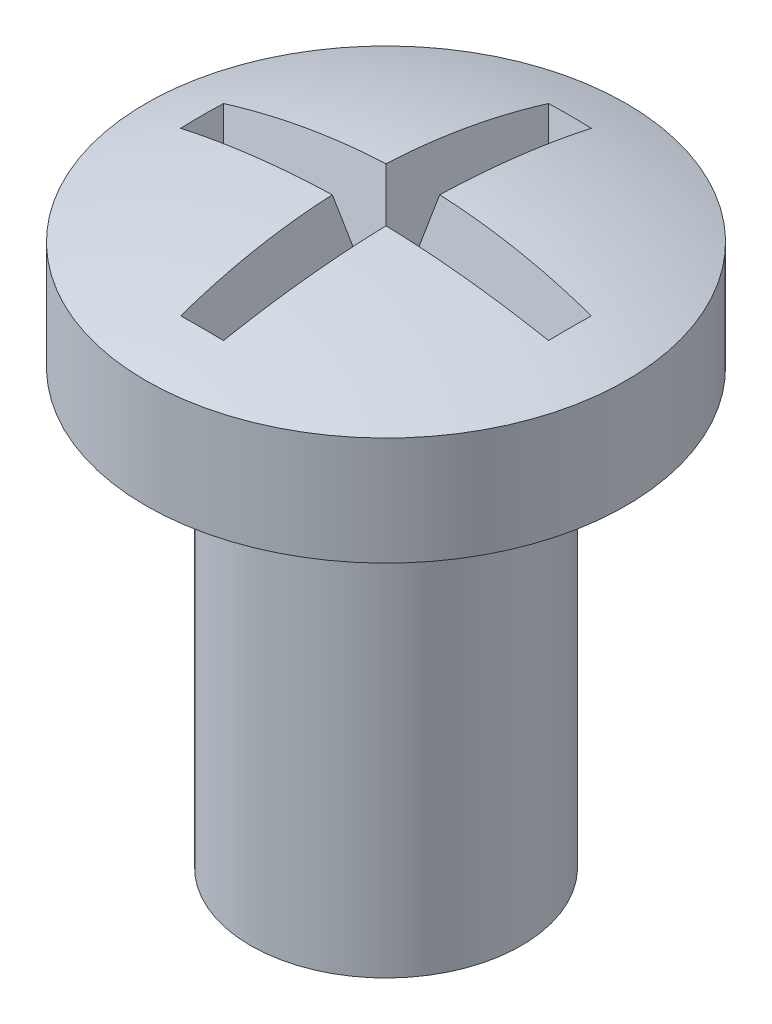
ISO-10303-21;
HEADER;
FILE_DESCRIPTION(('STEP AP214'),'2;1');
FILE_NAME('part.step','',(''),(''),'','','');
FILE_SCHEMA(('AUTOMOTIVE_DESIGN { 1 0 10303 214 1 1 1 1 }'));
ENDSEC;
DATA;
#1=APPLICATION_CONTEXT('core data for automotive mechanical design processes');
#2=APPLICATION_PROTOCOL_DEFINITION('international standard','automotive_design',2000,#1);
#3=PRODUCT_CONTEXT('',#1,'mechanical');
#4=PRODUCT('Part','Part','',(#3));
#5=PRODUCT_RELATED_PRODUCT_CATEGORY('part','',(#4));
#6=PRODUCT_DEFINITION_FORMATION('','',#4);
#7=PRODUCT_DEFINITION_CONTEXT('part definition',#1,'design');
#8=PRODUCT_DEFINITION('design','',#6,#7);
#9=PRODUCT_DEFINITION_SHAPE('','',#8);
#10=(LENGTH_UNIT() NAMED_UNIT(*) SI_UNIT(.MILLI.,.METRE.));
#11=(NAMED_UNIT(*) PLANE_ANGLE_UNIT() SI_UNIT($,.RADIAN.));
#12=(NAMED_UNIT(*) SI_UNIT($,.STERADIAN.) SOLID_ANGLE_UNIT());
#13=UNCERTAINTY_MEASURE_WITH_UNIT(LENGTH_MEASURE(1.E-05),#10,'distance_accuracy_value','');
#14=(GEOMETRIC_REPRESENTATION_CONTEXT(3) GLOBAL_UNCERTAINTY_ASSIGNED_CONTEXT((#13)) GLOBAL_UNIT_ASSIGNED_CONTEXT((#10,
#11,#12)) REPRESENTATION_CONTEXT('',''));
#15=CARTESIAN_POINT('',(0.,0.,0.));
#16=DIRECTION('',(0.,0.,1.));
#17=DIRECTION('',(1.,0.,0.));
#18=AXIS2_PLACEMENT_3D('',#15,#16,#17);
#19=CARTESIAN_POINT('',(0.,0.,0.));
#20=DIRECTION('',(0.,-1.,0.));
#21=DIRECTION('',(0.,0.,-1.));
#22=AXIS2_PLACEMENT_3D('',#19,#20,#21);
#23=PLANE('',#22);
#24=CARTESIAN_POINT('',(0.,0.,0.));
#25=DIRECTION('',(0.,1.,0.));
#26=DIRECTION('',(0.,0.,1.));
#27=AXIS2_PLACEMENT_3D('',#24,#25,#26);
#28=CIRCLE('',#27,1.25);
#29=CARTESIAN_POINT('',(0.,0.,1.25));
#30=VERTEX_POINT('',#29);
#31=EDGE_CURVE('E202',#30,#30,#28,.T.);
#32=ORIENTED_EDGE('',*,*,#31,.F.);
#33=EDGE_LOOP('',(#32));
#34=FACE_BOUND('',#33,.T.);
#35=ADVANCED_FACE('F39',(#34),#23,.T.);
#36=CARTESIAN_POINT('',(0.,5.38661268781676,0.));
#37=DIRECTION('',(0.,1.,0.));
#38=DIRECTION('',(0.,0.,1.));
#39=AXIS2_PLACEMENT_3D('',#36,#37,#38);
#40=CYLINDRICAL_SURFACE('',#39,1.25);
#41=ORIENTED_EDGE('',*,*,#31,.T.);
#42=EDGE_LOOP('',(#41));
#43=FACE_BOUND('',#42,.T.);
#44=CARTESIAN_POINT('',(0.,4.,0.));
#45=DIRECTION('',(0.,1.,0.));
#46=DIRECTION('',(0.,0.,1.));
#47=AXIS2_PLACEMENT_3D('',#44,#45,#46);
#48=CIRCLE('',#47,1.25);
#49=CARTESIAN_POINT('',(0.,4.,1.25));
#50=VERTEX_POINT('',#49);
#51=EDGE_CURVE('E198',#50,#50,#48,.T.);
#52=ORIENTED_EDGE('',*,*,#51,.F.);
#53=EDGE_LOOP('',(#52));
#54=FACE_BOUND('',#53,.T.);
#55=ADVANCED_FACE('F301',(#43,#54),#40,.T.);
#56=CARTESIAN_POINT('',(-1.25,4.,0.));
#57=DIRECTION('',(0.,-1.,0.));
#58=DIRECTION('',(0.,0.,-1.));
#59=AXIS2_PLACEMENT_3D('',#56,#57,#58);
#60=PLANE('',#59);
#61=ORIENTED_EDGE('',*,*,#51,.T.);
#62=EDGE_LOOP('',(#61));
#63=FACE_BOUND('',#62,.T.);
#64=CARTESIAN_POINT('',(0.,4.,0.));
#65=DIRECTION('',(0.,1.,0.));
#66=DIRECTION('',(0.,0.,1.));
#67=AXIS2_PLACEMENT_3D('',#64,#65,#66);
#68=CIRCLE('',#67,2.21653572712445);
#69=CARTESIAN_POINT('',(0.,4.,2.21653572712445));
#70=VERTEX_POINT('',#69);
#71=EDGE_CURVE('E194',#70,#70,#68,.T.);
#72=ORIENTED_EDGE('',*,*,#71,.F.);
#73=EDGE_LOOP('',(#72));
#74=FACE_BOUND('',#73,.T.);
#75=ADVANCED_FACE('F306',(#63,#74),#60,.T.);
#76=CARTESIAN_POINT('',(0.,5.38661268781676,0.));
#77=DIRECTION('',(0.,1.,0.));
#78=DIRECTION('',(0.,0.,1.));
#79=AXIS2_PLACEMENT_3D('',#76,#77,#78);
#80=CYLINDRICAL_SURFACE('',#79,2.21653572712445);
#81=ORIENTED_EDGE('',*,*,#71,.T.);
#82=EDGE_LOOP('',(#81));
#83=FACE_BOUND('',#82,.T.);
#84=CARTESIAN_POINT('',(0.,5.,0.));
#85=DIRECTION('',(0.,1.,0.));
#86=DIRECTION('',(0.,0.,1.));
#87=AXIS2_PLACEMENT_3D('',#84,#85,#86);
#88=CIRCLE('',#87,2.21653572712445);
#89=CARTESIAN_POINT('',(0.,5.,2.21653572712445));
#90=VERTEX_POINT('',#89);
#91=EDGE_CURVE('E133',#90,#90,#88,.T.);
#92=ORIENTED_EDGE('',*,*,#91,.F.);
#93=EDGE_LOOP('',(#92));
#94=FACE_BOUND('',#93,.T.);
#95=ADVANCED_FACE('F314',(#83,#94),#80,.T.);
#96=CARTESIAN_POINT('',(0.,-1.16063751831128,0.));
#97=DIRECTION('',(0.,1.,0.));
#98=DIRECTION('',(-1.,0.,0.));
#99=AXIS2_PLACEMENT_3D('',#96,#97,#98);
#100=SPHERICAL_SURFACE('',#99,6.54725020612804);
#101=CARTESIAN_POINT('',(-1.19771353480029,-0.884123561045328,0.));
#102=DIRECTION('',(0.974370064785235,-0.224951054343865,0.));
#103=DIRECTION('',(0.224951054343865,0.974370064785235,0.));
#104=AXIS2_PLACEMENT_3D('',#101,#102,#103);
#105=CIRCLE('',#104,6.43082479792732);
#106=CARTESIAN_POINT('',(0.247832627307662,5.37722476528932,-0.247832627307663));
#107=VERTEX_POINT('',#106);
#108=CARTESIAN_POINT('',(0.19759390976373,5.1596169722928,-1.69759390976373));
#109=VERTEX_POINT('',#108);
#110=EDGE_CURVE('E11',#107,#109,#105,.F.);
#111=ORIENTED_EDGE('',*,*,#110,.F.);
#112=CARTESIAN_POINT('',(0.,-0.884123561045328,1.19771353480029));
#113=DIRECTION('',(0.,-0.224951054343865,-0.974370064785235));
#114=DIRECTION('',(0.,0.974370064785235,-0.224951054343865));
#115=AXIS2_PLACEMENT_3D('',#112,#113,#114);
#116=CIRCLE('',#115,6.43082479792732);
#117=CARTESIAN_POINT('',(1.69759390976373,5.1596169722928,-0.197593909763731));
#118=VERTEX_POINT('',#117);
#119=EDGE_CURVE('E47',#118,#107,#116,.F.);
#120=ORIENTED_EDGE('',*,*,#119,.F.);
#121=CARTESIAN_POINT('',(0.226381999924083,-1.21290192113714,0.));
#122=DIRECTION('',(0.974370064785235,-0.224951054343865,0.));
#123=DIRECTION('',(0.224951054343865,0.974370064785235,0.));
#124=AXIS2_PLACEMENT_3D('',#121,#122,#123);
#125=CIRCLE('',#124,6.54312653736356);
#126=CARTESIAN_POINT('',(1.69759390976373,5.1596169722928,0.19759390976373));
#127=VERTEX_POINT('',#126);
#128=EDGE_CURVE('E233',#127,#118,#125,.F.);
#129=ORIENTED_EDGE('',*,*,#128,.F.);
#130=CARTESIAN_POINT('',(0.,-0.884123561045328,-1.19771353480029));
#131=DIRECTION('',(0.,-0.224951054343865,0.974370064785235));
#132=DIRECTION('',(0.,-0.974370064785235,-0.224951054343865));
#133=AXIS2_PLACEMENT_3D('',#130,#131,#132);
#134=CIRCLE('',#133,6.43082479792732);
#135=CARTESIAN_POINT('',(0.247832627307663,5.37722476528932,0.247832627307661));
#136=VERTEX_POINT('',#135);
#137=EDGE_CURVE('E230',#136,#127,#134,.F.);
#138=ORIENTED_EDGE('',*,*,#137,.F.);
#139=CARTESIAN_POINT('',(-1.19771353480029,-0.884123561045328,0.));
#140=DIRECTION('',(0.974370064785235,-0.224951054343865,0.));
#141=DIRECTION('',(0.224951054343865,0.974370064785235,0.));
#142=AXIS2_PLACEMENT_3D('',#139,#140,#141);
#143=CIRCLE('',#142,6.43082479792732);
#144=CARTESIAN_POINT('',(0.19759390976373,5.1596169722928,1.69759390976373));
#145=VERTEX_POINT('',#144);
#146=EDGE_CURVE('E227',#145,#136,#143,.F.);
#147=ORIENTED_EDGE('',*,*,#146,.F.);
#148=CARTESIAN_POINT('',(0.,-1.21290192113714,0.226381999924083));
#149=DIRECTION('',(0.,-0.224951054343865,0.974370064785235));
#150=DIRECTION('',(0.,-0.974370064785235,-0.224951054343865));
#151=AXIS2_PLACEMENT_3D('',#148,#149,#150);
#152=CIRCLE('',#151,6.54312653736356);
#153=CARTESIAN_POINT('',(-0.197593909763731,5.1596169722928,1.69759390976373));
#154=VERTEX_POINT('',#153);
#155=EDGE_CURVE('E224',#154,#145,#152,.F.);
#156=ORIENTED_EDGE('',*,*,#155,.F.);
#157=CARTESIAN_POINT('',(1.19771353480029,-0.884123561045328,0.));
#158=DIRECTION('',(-0.974370064785235,-0.224951054343865,0.));
#159=DIRECTION('',(0.224951054343865,-0.974370064785235,0.));
#160=AXIS2_PLACEMENT_3D('',#157,#158,#159);
#161=CIRCLE('',#160,6.43082479792732);
#162=CARTESIAN_POINT('',(-0.247832627307663,5.37722476528932,0.247832627307662));
#163=VERTEX_POINT('',#162);
#164=EDGE_CURVE('E221',#163,#154,#161,.F.);
#165=ORIENTED_EDGE('',*,*,#164,.F.);
#166=CARTESIAN_POINT('',(0.,-0.884123561045328,-1.19771353480029));
#167=DIRECTION('',(0.,-0.224951054343865,0.974370064785235));
#168=DIRECTION('',(0.,-0.974370064785235,-0.224951054343865));
#169=AXIS2_PLACEMENT_3D('',#166,#167,#168);
#170=CIRCLE('',#169,6.43082479792732);
#171=CARTESIAN_POINT('',(-1.69759390976373,5.1596169722928,0.19759390976373));
#172=VERTEX_POINT('',#171);
#173=EDGE_CURVE('E218',#172,#163,#170,.F.);
#174=ORIENTED_EDGE('',*,*,#173,.F.);
#175=CARTESIAN_POINT('',(-0.226381999924084,-1.21290192113714,0.));
#176=DIRECTION('',(-0.974370064785235,-0.224951054343865,0.));
#177=DIRECTION('',(0.224951054343865,-0.974370064785235,0.));
#178=AXIS2_PLACEMENT_3D('',#175,#176,#177);
#179=CIRCLE('',#178,6.54312653736356);
#180=CARTESIAN_POINT('',(-1.69759390976373,5.1596169722928,-0.197593909763731));
#181=VERTEX_POINT('',#180);
#182=EDGE_CURVE('E215',#181,#172,#179,.F.);
#183=ORIENTED_EDGE('',*,*,#182,.F.);
#184=CARTESIAN_POINT('',(0.,-0.884123561045328,1.19771353480029));
#185=DIRECTION('',(0.,-0.224951054343865,-0.974370064785235));
#186=DIRECTION('',(0.,0.974370064785235,-0.224951054343865));
#187=AXIS2_PLACEMENT_3D('',#184,#185,#186);
#188=CIRCLE('',#187,6.43082479792732);
#189=CARTESIAN_POINT('',(-0.247832627307663,5.37722476528932,-0.247832627307664));
#190=VERTEX_POINT('',#189);
#191=EDGE_CURVE('E212',#190,#181,#188,.F.);
#192=ORIENTED_EDGE('',*,*,#191,.F.);
#193=CARTESIAN_POINT('',(1.19771353480029,-0.884123561045328,0.));
#194=DIRECTION('',(-0.974370064785235,-0.224951054343865,0.));
#195=DIRECTION('',(0.224951054343865,-0.974370064785235,0.));
#196=AXIS2_PLACEMENT_3D('',#193,#194,#195);
#197=CIRCLE('',#196,6.43082479792732);
#198=CARTESIAN_POINT('',(-0.19759390976373,5.1596169722928,-1.69759390976373));
#199=VERTEX_POINT('',#198);
#200=EDGE_CURVE('E209',#199,#190,#197,.F.);
#201=ORIENTED_EDGE('',*,*,#200,.F.);
#202=CARTESIAN_POINT('',(0.,-1.21290192113714,-0.226381999924084));
#203=DIRECTION('',(0.,-0.224951054343865,-0.974370064785235));
#204=DIRECTION('',(0.,0.974370064785235,-0.224951054343865));
#205=AXIS2_PLACEMENT_3D('',#202,#203,#204);
#206=CIRCLE('',#205,6.54312653736356);
#207=EDGE_CURVE('E206',#109,#199,#206,.F.);
#208=ORIENTED_EDGE('',*,*,#207,.F.);
#209=EDGE_LOOP('',(#111,#120,#129,#138,#147,#156,#165,#174,#183,#192,#201,#208));
#210=FACE_BOUND('',#209,.T.);
#211=ORIENTED_EDGE('',*,*,#91,.T.);
#212=EDGE_LOOP('',(#211));
#213=FACE_BOUND('',#212,.T.);
#214=ADVANCED_FACE('F279',(#210,#213),#100,.T.);
#215=CARTESIAN_POINT('',(0.25,5.38661268781676,-0.250000000000001));
#216=DIRECTION('',(0.974370064785235,-0.224951054343865,0.));
#217=DIRECTION('',(0.224951054343865,0.974370064785235,0.));
#218=AXIS2_PLACEMENT_3D('',#215,#216,#217);
#219=PLANE('',#218);
#220=ORIENTED_EDGE('',*,*,#110,.T.);
#221=DIRECTION('',(0.219466743499904,0.950614904677543,-0.219466743499904));
#222=VECTOR('',#221,1.);
#223=CARTESIAN_POINT('',(0.177751522746321,5.07367015163868,-1.67775152274632));
#224=LINE('',#223,#222);
#225=CARTESIAN_POINT('',(0.0422186279869929,4.48661268781676,-1.54221862798699));
#226=VERTEX_POINT('',#225);
#227=EDGE_CURVE('E54',#226,#109,#224,.T.);
#228=ORIENTED_EDGE('',*,*,#227,.F.);
#229=DIRECTION('',(0.,0.,-1.));
#230=VECTOR('',#229,1.);
#231=CARTESIAN_POINT('',(0.0422186279869929,4.48661268781676,-0.250000000000001));
#232=LINE('',#231,#230);
#233=CARTESIAN_POINT('',(0.0422186279869929,4.48661268781676,-0.0422186279869938));
#234=VERTEX_POINT('',#233);
#235=EDGE_CURVE('E137',#234,#226,#232,.T.);
#236=ORIENTED_EDGE('',*,*,#235,.F.);
#237=DIRECTION('',(0.219466743499904,0.950614904677543,-0.219466743499904));
#238=VECTOR('',#237,1.);
#239=CARTESIAN_POINT('',(0.25,5.38661268781676,-0.250000000000001));
#240=LINE('',#239,#238);
#241=EDGE_CURVE('E125',#234,#107,#240,.T.);
#242=ORIENTED_EDGE('',*,*,#241,.T.);
#243=EDGE_LOOP('',(#220,#228,#236,#242));
#244=FACE_BOUND('',#243,.T.);
#245=ADVANCED_FACE('F138',(#244),#219,.F.);
#246=CARTESIAN_POINT('',(1.75,5.38661268781676,-0.250000000000001));
#247=DIRECTION('',(0.,-0.224951054343865,-0.974370064785235));
#248=DIRECTION('',(0.,0.974370064785235,-0.224951054343865));
#249=AXIS2_PLACEMENT_3D('',#246,#247,#248);
#250=PLANE('',#249);
#251=ORIENTED_EDGE('',*,*,#119,.T.);
#252=ORIENTED_EDGE('',*,*,#241,.F.);
#253=DIRECTION('',(-1.,0.,0.));
#254=VECTOR('',#253,1.);
#255=CARTESIAN_POINT('',(1.75,4.48661268781676,-0.0422186279869937));
#256=LINE('',#255,#254);
#257=CARTESIAN_POINT('',(1.54221862798699,4.48661268781676,-0.0422186279869937));
#258=VERTEX_POINT('',#257);
#259=EDGE_CURVE('E129',#258,#234,#256,.T.);
#260=ORIENTED_EDGE('',*,*,#259,.F.);
#261=DIRECTION('',(0.219466743499904,0.950614904677543,-0.219466743499904));
#262=VECTOR('',#261,1.);
#263=CARTESIAN_POINT('',(1.72591717424877,5.28229850909073,-0.225917174248774));
#264=LINE('',#263,#262);
#265=EDGE_CURVE('E134',#258,#118,#264,.T.);
#266=ORIENTED_EDGE('',*,*,#265,.T.);
#267=EDGE_LOOP('',(#251,#252,#260,#266));
#268=FACE_BOUND('',#267,.T.);
#269=ADVANCED_FACE('F127',(#268),#250,.F.);
#270=CARTESIAN_POINT('',(1.75,5.38661268781676,0.249999999999999));
#271=DIRECTION('',(0.974370064785235,-0.224951054343865,0.));
#272=DIRECTION('',(0.224951054343865,0.974370064785235,0.));
#273=AXIS2_PLACEMENT_3D('',#270,#271,#272);
#274=PLANE('',#273);
#275=ORIENTED_EDGE('',*,*,#128,.T.);
#276=ORIENTED_EDGE('',*,*,#265,.F.);
#277=DIRECTION('',(0.,0.,-1.));
#278=VECTOR('',#277,1.);
#279=CARTESIAN_POINT('',(1.54221862798699,4.48661268781676,0.249999999999999));
#280=LINE('',#279,#278);
#281=CARTESIAN_POINT('',(1.54221862798699,4.48661268781676,0.0422186279869921));
#282=VERTEX_POINT('',#281);
#283=EDGE_CURVE('E148',#282,#258,#280,.T.);
#284=ORIENTED_EDGE('',*,*,#283,.F.);
#285=DIRECTION('',(0.219466743499904,0.950614904677543,0.219466743499904));
#286=VECTOR('',#285,1.);
#287=CARTESIAN_POINT('',(1.75,5.38661268781676,0.249999999999999));
#288=LINE('',#287,#286);
#289=EDGE_CURVE('E238',#282,#127,#288,.T.);
#290=ORIENTED_EDGE('',*,*,#289,.T.);
#291=EDGE_LOOP('',(#275,#276,#284,#290));
#292=FACE_BOUND('',#291,.T.);
#293=ADVANCED_FACE('F330',(#292),#274,.F.);
#294=CARTESIAN_POINT('',(1.75,5.38661268781676,0.249999999999999));
#295=DIRECTION('',(0.,-0.224951054343865,0.974370064785235));
#296=DIRECTION('',(0.,-0.974370064785235,-0.224951054343865));
#297=AXIS2_PLACEMENT_3D('',#294,#295,#296);
#298=PLANE('',#297);
#299=ORIENTED_EDGE('',*,*,#137,.T.);
#300=ORIENTED_EDGE('',*,*,#289,.F.);
#301=DIRECTION('',(1.,0.,0.));
#302=VECTOR('',#301,1.);
#303=CARTESIAN_POINT('',(1.75,4.48661268781676,0.0422186279869921));
#304=LINE('',#303,#302);
#305=CARTESIAN_POINT('',(0.0422186279869929,4.48661268781676,0.0422186279869921));
#306=VERTEX_POINT('',#305);
#307=EDGE_CURVE('E155',#306,#282,#304,.T.);
#308=ORIENTED_EDGE('',*,*,#307,.F.);
#309=DIRECTION('',(0.219466743499904,0.950614904677543,0.219466743499904));
#310=VECTOR('',#309,1.);
#311=CARTESIAN_POINT('',(0.322248477253679,5.69955522399484,0.322248477253678));
#312=LINE('',#311,#310);
#313=EDGE_CURVE('E241',#306,#136,#312,.T.);
#314=ORIENTED_EDGE('',*,*,#313,.T.);
#315=EDGE_LOOP('',(#299,#300,#308,#314));
#316=FACE_BOUND('',#315,.T.);
#317=ADVANCED_FACE('F333',(#316),#298,.F.);
#318=CARTESIAN_POINT('',(0.25,5.38661268781676,1.75));
#319=DIRECTION('',(0.974370064785235,-0.224951054343865,0.));
#320=DIRECTION('',(0.224951054343865,0.974370064785235,0.));
#321=AXIS2_PLACEMENT_3D('',#318,#319,#320);
#322=PLANE('',#321);
#323=ORIENTED_EDGE('',*,*,#146,.T.);
#324=ORIENTED_EDGE('',*,*,#313,.F.);
#325=DIRECTION('',(0.,0.,-1.));
#326=VECTOR('',#325,1.);
#327=CARTESIAN_POINT('',(0.0422186279869929,4.48661268781676,1.75));
#328=LINE('',#327,#326);
#329=CARTESIAN_POINT('',(0.0422186279869929,4.48661268781676,1.54221862798699));
#330=VERTEX_POINT('',#329);
#331=EDGE_CURVE('E161',#330,#306,#328,.T.);
#332=ORIENTED_EDGE('',*,*,#331,.F.);
#333=DIRECTION('',(0.219466743499904,0.950614904677543,0.219466743499904));
#334=VECTOR('',#333,1.);
#335=CARTESIAN_POINT('',(0.225917174248774,5.28229850909073,1.72591717424877));
#336=LINE('',#335,#334);
#337=EDGE_CURVE('E245',#330,#145,#336,.T.);
#338=ORIENTED_EDGE('',*,*,#337,.T.);
#339=EDGE_LOOP('',(#323,#324,#332,#338));
#340=FACE_BOUND('',#339,.T.);
#341=ADVANCED_FACE('F337',(#340),#322,.F.);
#342=CARTESIAN_POINT('',(-0.25,5.38661268781676,1.75));
#343=DIRECTION('',(0.,-0.224951054343865,0.974370064785235));
#344=DIRECTION('',(0.,-0.974370064785235,-0.224951054343865));
#345=AXIS2_PLACEMENT_3D('',#342,#343,#344);
#346=PLANE('',#345);
#347=ORIENTED_EDGE('',*,*,#155,.T.);
#348=ORIENTED_EDGE('',*,*,#337,.F.);
#349=DIRECTION('',(1.,0.,0.));
#350=VECTOR('',#349,1.);
#351=CARTESIAN_POINT('',(-0.25,4.48661268781676,1.54221862798699));
#352=LINE('',#351,#350);
#353=CARTESIAN_POINT('',(-0.0422186279869929,4.48661268781676,1.54221862798699));
#354=VERTEX_POINT('',#353);
#355=EDGE_CURVE('E165',#354,#330,#352,.T.);
#356=ORIENTED_EDGE('',*,*,#355,.F.);
#357=DIRECTION('',(-0.219466743499904,0.950614904677543,0.219466743499904));
#358=VECTOR('',#357,1.);
#359=CARTESIAN_POINT('',(-0.25,5.38661268781676,1.75));
#360=LINE('',#359,#358);
#361=EDGE_CURVE('E249',#354,#154,#360,.T.);
#362=ORIENTED_EDGE('',*,*,#361,.T.);
#363=EDGE_LOOP('',(#347,#348,#356,#362));
#364=FACE_BOUND('',#363,.T.);
#365=ADVANCED_FACE('F341',(#364),#346,.F.);
#366=CARTESIAN_POINT('',(-0.25,5.38661268781676,1.75));
#367=DIRECTION('',(-0.974370064785235,-0.224951054343865,0.));
#368=DIRECTION('',(0.224951054343865,-0.974370064785235,0.));
#369=AXIS2_PLACEMENT_3D('',#366,#367,#368);
#370=PLANE('',#369);
#371=ORIENTED_EDGE('',*,*,#164,.T.);
#372=ORIENTED_EDGE('',*,*,#361,.F.);
#373=DIRECTION('',(0.,0.,1.));
#374=VECTOR('',#373,1.);
#375=CARTESIAN_POINT('',(-0.0422186279869929,4.48661268781676,1.75));
#376=LINE('',#375,#374);
#377=CARTESIAN_POINT('',(-0.0422186279869928,4.48661268781676,0.0422186279869921));
#378=VERTEX_POINT('',#377);
#379=EDGE_CURVE('E169',#378,#354,#376,.T.);
#380=ORIENTED_EDGE('',*,*,#379,.F.);
#381=DIRECTION('',(-0.219466743499904,0.950614904677543,0.219466743499904));
#382=VECTOR('',#381,1.);
#383=CARTESIAN_POINT('',(-0.322248477253679,5.69955522399484,0.322248477253678));
#384=LINE('',#383,#382);
#385=EDGE_CURVE('E253',#378,#163,#384,.T.);
#386=ORIENTED_EDGE('',*,*,#385,.T.);
#387=EDGE_LOOP('',(#371,#372,#380,#386));
#388=FACE_BOUND('',#387,.T.);
#389=ADVANCED_FACE('F345',(#388),#370,.F.);
#390=CARTESIAN_POINT('',(-0.25,5.38661268781676,0.249999999999999));
#391=DIRECTION('',(0.,-0.224951054343865,0.974370064785235));
#392=DIRECTION('',(0.,-0.974370064785235,-0.224951054343865));
#393=AXIS2_PLACEMENT_3D('',#390,#391,#392);
#394=PLANE('',#393);
#395=ORIENTED_EDGE('',*,*,#173,.T.);
#396=ORIENTED_EDGE('',*,*,#385,.F.);
#397=DIRECTION('',(1.,0.,0.));
#398=VECTOR('',#397,1.);
#399=CARTESIAN_POINT('',(-0.25,4.48661268781676,0.0422186279869921));
#400=LINE('',#399,#398);
#401=CARTESIAN_POINT('',(-1.54221862798699,4.48661268781676,0.0422186279869921));
#402=VERTEX_POINT('',#401);
#403=EDGE_CURVE('E173',#402,#378,#400,.T.);
#404=ORIENTED_EDGE('',*,*,#403,.F.);
#405=DIRECTION('',(-0.219466743499904,0.950614904677543,0.219466743499904));
#406=VECTOR('',#405,1.);
#407=CARTESIAN_POINT('',(-1.75,5.38661268781676,0.249999999999999));
#408=LINE('',#407,#406);
#409=EDGE_CURVE('E257',#402,#172,#408,.T.);
#410=ORIENTED_EDGE('',*,*,#409,.T.);
#411=EDGE_LOOP('',(#395,#396,#404,#410));
#412=FACE_BOUND('',#411,.T.);
#413=ADVANCED_FACE('F349',(#412),#394,.F.);
#414=CARTESIAN_POINT('',(-1.75,5.38661268781676,0.249999999999999));
#415=DIRECTION('',(-0.974370064785235,-0.224951054343865,0.));
#416=DIRECTION('',(0.224951054343865,-0.974370064785235,0.));
#417=AXIS2_PLACEMENT_3D('',#414,#415,#416);
#418=PLANE('',#417);
#419=ORIENTED_EDGE('',*,*,#182,.T.);
#420=ORIENTED_EDGE('',*,*,#409,.F.);
#421=DIRECTION('',(0.,0.,1.));
#422=VECTOR('',#421,1.);
#423=CARTESIAN_POINT('',(-1.54221862798699,4.48661268781676,0.249999999999999));
#424=LINE('',#423,#422);
#425=CARTESIAN_POINT('',(-1.54221862798699,4.48661268781676,-0.0422186279869937));
#426=VERTEX_POINT('',#425);
#427=EDGE_CURVE('E177',#426,#402,#424,.T.);
#428=ORIENTED_EDGE('',*,*,#427,.F.);
#429=DIRECTION('',(-0.219466743499904,0.950614904677543,-0.219466743499904));
#430=VECTOR('',#429,1.);
#431=CARTESIAN_POINT('',(-1.67775152274632,5.07367015163868,-0.177751522746322));
#432=LINE('',#431,#430);
#433=EDGE_CURVE('E261',#426,#181,#432,.T.);
#434=ORIENTED_EDGE('',*,*,#433,.T.);
#435=EDGE_LOOP('',(#419,#420,#428,#434));
#436=FACE_BOUND('',#435,.T.);
#437=ADVANCED_FACE('F288',(#436),#418,.F.);
#438=CARTESIAN_POINT('',(-0.25,5.38661268781676,-0.250000000000001));
#439=DIRECTION('',(0.,-0.224951054343865,-0.974370064785235));
#440=DIRECTION('',(0.,0.974370064785235,-0.224951054343865));
#441=AXIS2_PLACEMENT_3D('',#438,#439,#440);
#442=PLANE('',#441);
#443=ORIENTED_EDGE('',*,*,#191,.T.);
#444=ORIENTED_EDGE('',*,*,#433,.F.);
#445=DIRECTION('',(-1.,0.,0.));
#446=VECTOR('',#445,1.);
#447=CARTESIAN_POINT('',(-0.25,4.48661268781676,-0.0422186279869937));
#448=LINE('',#447,#446);
#449=CARTESIAN_POINT('',(-0.0422186279869928,4.48661268781676,-0.0422186279869937));
#450=VERTEX_POINT('',#449);
#451=EDGE_CURVE('E181',#450,#426,#448,.T.);
#452=ORIENTED_EDGE('',*,*,#451,.F.);
#453=DIRECTION('',(-0.219466743499904,0.950614904677543,-0.219466743499904));
#454=VECTOR('',#453,1.);
#455=CARTESIAN_POINT('',(-0.25,5.38661268781676,-0.250000000000001));
#456=LINE('',#455,#454);
#457=EDGE_CURVE('E265',#450,#190,#456,.T.);
#458=ORIENTED_EDGE('',*,*,#457,.T.);
#459=EDGE_LOOP('',(#443,#444,#452,#458));
#460=FACE_BOUND('',#459,.T.);
#461=ADVANCED_FACE('F284',(#460),#442,.F.);
#462=CARTESIAN_POINT('',(-0.25,5.38661268781676,-0.250000000000001));
#463=DIRECTION('',(-0.974370064785235,-0.224951054343865,0.));
#464=DIRECTION('',(0.224951054343865,-0.974370064785235,0.));
#465=AXIS2_PLACEMENT_3D('',#462,#463,#464);
#466=PLANE('',#465);
#467=ORIENTED_EDGE('',*,*,#200,.T.);
#468=ORIENTED_EDGE('',*,*,#457,.F.);
#469=DIRECTION('',(0.,0.,1.));
#470=VECTOR('',#469,1.);
#471=CARTESIAN_POINT('',(-0.0422186279869928,4.48661268781676,-0.250000000000001));
#472=LINE('',#471,#470);
#473=CARTESIAN_POINT('',(-0.0422186279869928,4.48661268781676,-1.54221862798699));
#474=VERTEX_POINT('',#473);
#475=EDGE_CURVE('E185',#474,#450,#472,.T.);
#476=ORIENTED_EDGE('',*,*,#475,.F.);
#477=DIRECTION('',(-0.219466743499904,0.950614904677543,-0.219466743499904));
#478=VECTOR('',#477,1.);
#479=CARTESIAN_POINT('',(-0.25,5.38661268781676,-1.75));
#480=LINE('',#479,#478);
#481=EDGE_CURVE('E153',#474,#199,#480,.T.);
#482=ORIENTED_EDGE('',*,*,#481,.T.);
#483=EDGE_LOOP('',(#467,#468,#476,#482));
#484=FACE_BOUND('',#483,.T.);
#485=ADVANCED_FACE('F275',(#484),#466,.F.);
#486=CARTESIAN_POINT('',(-0.25,5.38661268781676,-1.75));
#487=DIRECTION('',(0.,-0.224951054343865,-0.974370064785235));
#488=DIRECTION('',(0.,0.974370064785235,-0.224951054343865));
#489=AXIS2_PLACEMENT_3D('',#486,#487,#488);
#490=PLANE('',#489);
#491=ORIENTED_EDGE('',*,*,#207,.T.);
#492=ORIENTED_EDGE('',*,*,#481,.F.);
#493=DIRECTION('',(-1.,0.,0.));
#494=VECTOR('',#493,1.);
#495=CARTESIAN_POINT('',(-0.25,4.48661268781676,-1.54221862798699));
#496=LINE('',#495,#494);
#497=EDGE_CURVE('E142',#226,#474,#496,.T.);
#498=ORIENTED_EDGE('',*,*,#497,.F.);
#499=ORIENTED_EDGE('',*,*,#227,.T.);
#500=EDGE_LOOP('',(#491,#492,#498,#499));
#501=FACE_BOUND('',#500,.T.);
#502=ADVANCED_FACE('F290',(#501),#490,.F.);
#503=CARTESIAN_POINT('',(0.,4.48661268781676,0.));
#504=DIRECTION('',(0.,-1.,0.));
#505=DIRECTION('',(0.,0.,-1.));
#506=AXIS2_PLACEMENT_3D('',#503,#504,#505);
#507=PLANE('',#506);
#508=ORIENTED_EDGE('',*,*,#235,.T.);
#509=ORIENTED_EDGE('',*,*,#497,.T.);
#510=ORIENTED_EDGE('',*,*,#475,.T.);
#511=ORIENTED_EDGE('',*,*,#451,.T.);
#512=ORIENTED_EDGE('',*,*,#427,.T.);
#513=ORIENTED_EDGE('',*,*,#403,.T.);
#514=ORIENTED_EDGE('',*,*,#379,.T.);
#515=ORIENTED_EDGE('',*,*,#355,.T.);
#516=ORIENTED_EDGE('',*,*,#331,.T.);
#517=ORIENTED_EDGE('',*,*,#307,.T.);
#518=ORIENTED_EDGE('',*,*,#283,.T.);
#519=ORIENTED_EDGE('',*,*,#259,.T.);
#520=EDGE_LOOP('',(#508,#509,#510,#511,#512,#513,#514,#515,#516,#517,#518,#519));
#521=FACE_BOUND('',#520,.T.);
#522=ADVANCED_FACE('F145',(#521),#507,.F.);
#523=CLOSED_SHELL('',(#35,#55,#75,#95,#214,#245,#269,#293,#317,#341,#365,#389,#413,#437,#461,
#485,#502,#522));
#524=MANIFOLD_SOLID_BREP('B2',#523);
#525=ADVANCED_BREP_SHAPE_REPRESENTATION('',(#18,#524),#14);
#526=SHAPE_DEFINITION_REPRESENTATION(#9,#525);
ENDSEC;
END-ISO-10303-21;
